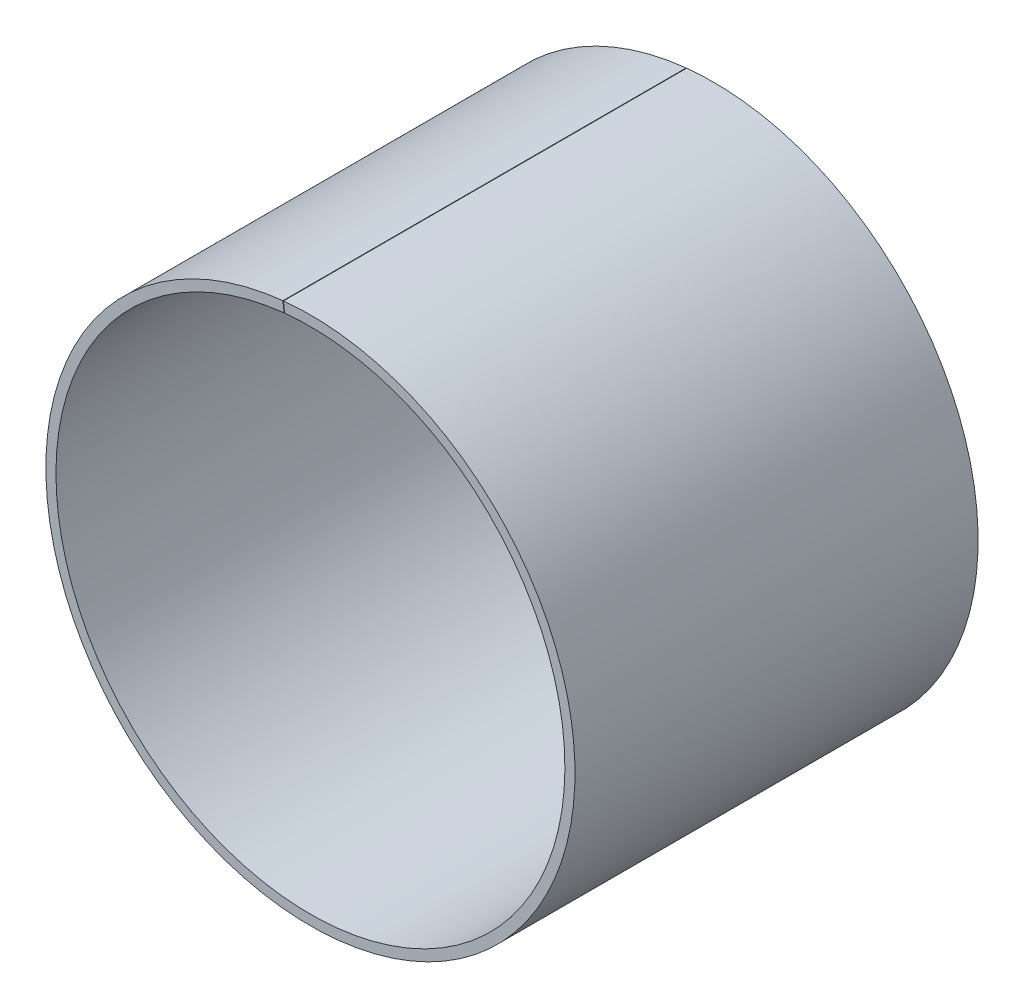
ISO-10303-21;
HEADER;
FILE_DESCRIPTION(('STEP AP214'),'2;1');
FILE_NAME('part.step','',(''),(''),'','','');
FILE_SCHEMA(('AUTOMOTIVE_DESIGN { 1 0 10303 214 1 1 1 1 }'));
ENDSEC;
DATA;
#1=APPLICATION_CONTEXT('core data for automotive mechanical design processes');
#2=APPLICATION_PROTOCOL_DEFINITION('international standard','automotive_design',2000,#1);
#3=PRODUCT_CONTEXT('',#1,'mechanical');
#4=PRODUCT('Part','Part','',(#3));
#5=PRODUCT_RELATED_PRODUCT_CATEGORY('part','',(#4));
#6=PRODUCT_DEFINITION_FORMATION('','',#4);
#7=PRODUCT_DEFINITION_CONTEXT('part definition',#1,'design');
#8=PRODUCT_DEFINITION('design','',#6,#7);
#9=PRODUCT_DEFINITION_SHAPE('','',#8);
#10=(LENGTH_UNIT() NAMED_UNIT(*) SI_UNIT(.MILLI.,.METRE.));
#11=(NAMED_UNIT(*) PLANE_ANGLE_UNIT() SI_UNIT($,.RADIAN.));
#12=(NAMED_UNIT(*) SI_UNIT($,.STERADIAN.) SOLID_ANGLE_UNIT());
#13=UNCERTAINTY_MEASURE_WITH_UNIT(LENGTH_MEASURE(1.E-05),#10,'distance_accuracy_value','');
#14=(GEOMETRIC_REPRESENTATION_CONTEXT(3) GLOBAL_UNCERTAINTY_ASSIGNED_CONTEXT((#13)) GLOBAL_UNIT_ASSIGNED_CONTEXT((#10,
#11,#12)) REPRESENTATION_CONTEXT('',''));
#15=CARTESIAN_POINT('',(0.,0.,0.));
#16=DIRECTION('',(0.,0.,1.));
#17=DIRECTION('',(1.,0.,0.));
#18=AXIS2_PLACEMENT_3D('',#15,#16,#17);
#19=CARTESIAN_POINT('',(0.,-1.11022302462516E-13,80.));
#20=DIRECTION('',(0.,0.,-1.));
#21=DIRECTION('',(-1.,0.,0.));
#22=AXIS2_PLACEMENT_3D('',#19,#20,#21);
#23=CYLINDRICAL_SURFACE('',#22,52.5);
#24=CARTESIAN_POINT('',(0.,0.,0.));
#25=DIRECTION('',(0.,0.,1.));
#26=DIRECTION('',(1.,0.,0.));
#27=AXIS2_PLACEMENT_3D('',#24,#25,#26);
#28=CIRCLE('',#27,52.5);
#29=CARTESIAN_POINT('',(-5.44720049857328,52.2166449202583,-1.11022302462516E-13));
#30=VERTEX_POINT('',#29);
#31=CARTESIAN_POINT('',(-5.34220049857326,52.2274917436502,-1.11022302462516E-13));
#32=VERTEX_POINT('',#31);
#33=EDGE_CURVE('E100',#30,#32,#28,.T.);
#34=ORIENTED_EDGE('',*,*,#33,.T.);
#35=DIRECTION('',(0.,0.,-1.));
#36=VECTOR('',#35,1.);
#37=CARTESIAN_POINT('',(-5.34220049857348,52.2274917436501,80.));
#38=LINE('',#37,#36);
#39=CARTESIAN_POINT('',(-5.34220049857348,52.2274917436501,80.));
#40=VERTEX_POINT('',#39);
#41=EDGE_CURVE('E11',#40,#32,#38,.T.);
#42=ORIENTED_EDGE('',*,*,#41,.F.);
#43=CARTESIAN_POINT('',(0.,-1.11022302462516E-13,80.));
#44=DIRECTION('',(0.,0.,1.));
#45=DIRECTION('',(1.,0.,0.));
#46=AXIS2_PLACEMENT_3D('',#43,#44,#45);
#47=CIRCLE('',#46,52.5);
#48=CARTESIAN_POINT('',(-5.4472004985735,52.2166449202584,80.));
#49=VERTEX_POINT('',#48);
#50=EDGE_CURVE('E77',#49,#40,#47,.T.);
#51=ORIENTED_EDGE('',*,*,#50,.F.);
#52=DIRECTION('',(0.,0.,-1.));
#53=VECTOR('',#52,1.);
#54=CARTESIAN_POINT('',(-5.4472004985735,52.2166449202584,80.));
#55=LINE('',#54,#53);
#56=EDGE_CURVE('E53',#49,#30,#55,.T.);
#57=ORIENTED_EDGE('',*,*,#56,.T.);
#58=EDGE_LOOP('',(#34,#42,#51,#57));
#59=FACE_BOUND('',#58,.T.);
#60=ADVANCED_FACE('F37',(#59),#23,.T.);
#61=CARTESIAN_POINT('',(-5.13868809862772,50.2378730105587,80.));
#62=DIRECTION('',(-0.994809366545717,-0.101756199972824,0.));
#63=DIRECTION('',(0.101756199972824,-0.994809366545717,0.));
#64=AXIS2_PLACEMENT_3D('',#61,#62,#63);
#65=PLANE('',#64);
#66=DIRECTION('',(-0.101756199972824,0.994809366545717,0.));
#67=VECTOR('',#66,1.);
#68=CARTESIAN_POINT('',(-5.13868809862772,50.2378730105587,-1.11022302462516E-13));
#69=LINE('',#68,#67);
#70=CARTESIAN_POINT('',(-5.13868809862772,50.2378730105587,-1.11022302462516E-13));
#71=VERTEX_POINT('',#70);
#72=EDGE_CURVE('E86',#71,#32,#69,.T.);
#73=ORIENTED_EDGE('',*,*,#72,.F.);
#74=DIRECTION('',(0.,0.,-1.));
#75=VECTOR('',#74,1.);
#76=CARTESIAN_POINT('',(-5.13868809862772,50.2378730105587,80.));
#77=LINE('',#76,#75);
#78=CARTESIAN_POINT('',(-5.13868809862772,50.2378730105587,80.));
#79=VERTEX_POINT('',#78);
#80=EDGE_CURVE('E45',#79,#71,#77,.T.);
#81=ORIENTED_EDGE('',*,*,#80,.F.);
#82=DIRECTION('',(-0.101756199972824,0.994809366545717,0.));
#83=VECTOR('',#82,1.);
#84=CARTESIAN_POINT('',(-5.13868809862772,50.2378730105587,80.));
#85=LINE('',#84,#83);
#86=EDGE_CURVE('E84',#79,#40,#85,.T.);
#87=ORIENTED_EDGE('',*,*,#86,.T.);
#88=ORIENTED_EDGE('',*,*,#41,.T.);
#89=EDGE_LOOP('',(#73,#81,#87,#88));
#90=FACE_BOUND('',#89,.T.);
#91=ADVANCED_FACE('F83',(#90),#65,.T.);
#92=CARTESIAN_POINT('',(0.,-1.11022302462516E-13,80.));
#93=DIRECTION('',(0.,0.,-1.));
#94=DIRECTION('',(-1.,0.,0.));
#95=AXIS2_PLACEMENT_3D('',#92,#93,#94);
#96=CYLINDRICAL_SURFACE('',#95,50.5);
#97=CARTESIAN_POINT('',(0.,0.,0.));
#98=DIRECTION('',(0.,0.,1.));
#99=DIRECTION('',(1.,0.,0.));
#100=AXIS2_PLACEMENT_3D('',#97,#98,#99);
#101=CIRCLE('',#100,50.5);
#102=CARTESIAN_POINT('',(-5.23968809862763,50.2274393994866,-1.11022302462516E-13));
#103=VERTEX_POINT('',#102);
#104=EDGE_CURVE('E103',#103,#71,#101,.T.);
#105=ORIENTED_EDGE('',*,*,#104,.F.);
#106=DIRECTION('',(0.,0.,-1.));
#107=VECTOR('',#106,1.);
#108=CARTESIAN_POINT('',(-5.23968809862785,50.2274393994866,80.));
#109=LINE('',#108,#107);
#110=CARTESIAN_POINT('',(-5.23968809862785,50.2274393994866,80.));
#111=VERTEX_POINT('',#110);
#112=EDGE_CURVE('E66',#111,#103,#109,.T.);
#113=ORIENTED_EDGE('',*,*,#112,.F.);
#114=CARTESIAN_POINT('',(0.,-1.11022302462516E-13,80.));
#115=DIRECTION('',(0.,0.,1.));
#116=DIRECTION('',(1.,0.,0.));
#117=AXIS2_PLACEMENT_3D('',#114,#115,#116);
#118=CIRCLE('',#117,50.5);
#119=EDGE_CURVE('E92',#111,#79,#118,.T.);
#120=ORIENTED_EDGE('',*,*,#119,.T.);
#121=ORIENTED_EDGE('',*,*,#80,.T.);
#122=EDGE_LOOP('',(#105,#113,#120,#121));
#123=FACE_BOUND('',#122,.T.);
#124=ADVANCED_FACE('F94',(#123),#96,.F.);
#125=CARTESIAN_POINT('',(-5.4472004985735,52.2166449202584,80.));
#126=DIRECTION('',(0.994602760385873,0.103756199972824,0.));
#127=DIRECTION('',(-0.103756199972824,0.994602760385873,0.));
#128=AXIS2_PLACEMENT_3D('',#125,#126,#127);
#129=PLANE('',#128);
#130=DIRECTION('',(0.103756199972824,-0.994602760385874,0.));
#131=VECTOR('',#130,1.);
#132=CARTESIAN_POINT('',(-5.44720049857328,52.2166449202583,-1.11022302462516E-13));
#133=LINE('',#132,#131);
#134=EDGE_CURVE('E105',#30,#103,#133,.T.);
#135=ORIENTED_EDGE('',*,*,#134,.F.);
#136=ORIENTED_EDGE('',*,*,#56,.F.);
#137=DIRECTION('',(0.103756199972824,-0.994602760385874,0.));
#138=VECTOR('',#137,1.);
#139=CARTESIAN_POINT('',(-5.4472004985735,52.2166449202584,80.));
#140=LINE('',#139,#138);
#141=EDGE_CURVE('E95',#49,#111,#140,.T.);
#142=ORIENTED_EDGE('',*,*,#141,.T.);
#143=ORIENTED_EDGE('',*,*,#112,.T.);
#144=EDGE_LOOP('',(#135,#136,#142,#143));
#145=FACE_BOUND('',#144,.T.);
#146=ADVANCED_FACE('F111',(#145),#129,.T.);
#147=CARTESIAN_POINT('',(0.,-1.11022302462516E-13,80.));
#148=DIRECTION('',(0.,0.,1.));
#149=DIRECTION('',(1.,0.,0.));
#150=AXIS2_PLACEMENT_3D('',#147,#148,#149);
#151=PLANE('',#150);
#152=ORIENTED_EDGE('',*,*,#50,.T.);
#153=ORIENTED_EDGE('',*,*,#86,.F.);
#154=ORIENTED_EDGE('',*,*,#119,.F.);
#155=ORIENTED_EDGE('',*,*,#141,.F.);
#156=EDGE_LOOP('',(#152,#153,#154,#155));
#157=FACE_BOUND('',#156,.T.);
#158=ADVANCED_FACE('F91',(#157),#151,.T.);
#159=CARTESIAN_POINT('',(0.,0.,0.));
#160=DIRECTION('',(0.,0.,1.));
#161=DIRECTION('',(1.,0.,0.));
#162=AXIS2_PLACEMENT_3D('',#159,#160,#161);
#163=PLANE('',#162);
#164=ORIENTED_EDGE('',*,*,#33,.F.);
#165=ORIENTED_EDGE('',*,*,#134,.T.);
#166=ORIENTED_EDGE('',*,*,#104,.T.);
#167=ORIENTED_EDGE('',*,*,#72,.T.);
#168=EDGE_LOOP('',(#164,#165,#166,#167));
#169=FACE_BOUND('',#168,.T.);
#170=ADVANCED_FACE('F110',(#169),#163,.F.);
#171=CLOSED_SHELL('',(#60,#91,#124,#146,#158,#170));
#172=MANIFOLD_SOLID_BREP('B2',#171);
#173=ADVANCED_BREP_SHAPE_REPRESENTATION('',(#18,#172),#14);
#174=SHAPE_DEFINITION_REPRESENTATION(#9,#173);
ENDSEC;
END-ISO-10303-21;
